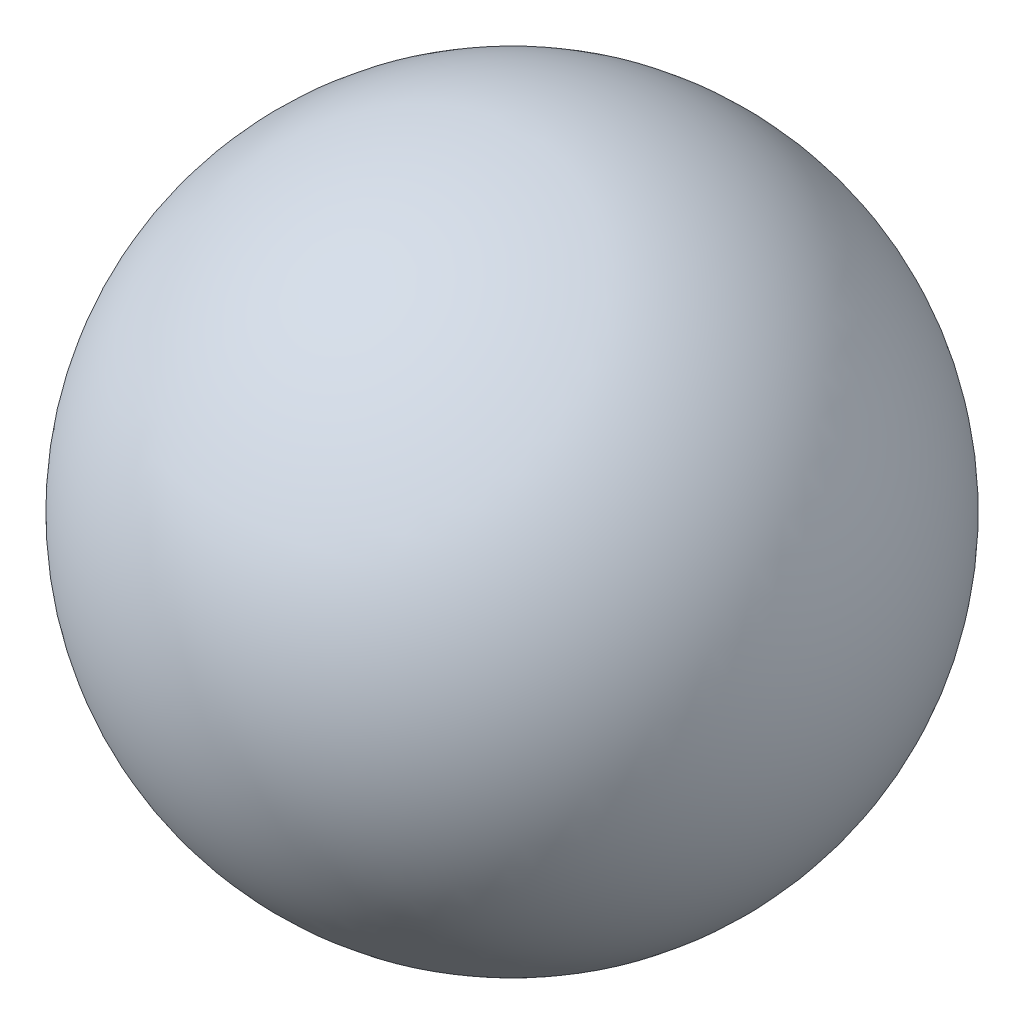
ISO-10303-21;
HEADER;
FILE_DESCRIPTION(('STEP AP214'),'2;1');
FILE_NAME('part.step','',(''),(''),'','','');
FILE_SCHEMA(('AUTOMOTIVE_DESIGN { 1 0 10303 214 1 1 1 1 }'));
ENDSEC;
DATA;
#1=APPLICATION_CONTEXT('core data for automotive mechanical design processes');
#2=APPLICATION_PROTOCOL_DEFINITION('international standard','automotive_design',2000,#1);
#3=PRODUCT_CONTEXT('',#1,'mechanical');
#4=PRODUCT('Part','Part','',(#3));
#5=PRODUCT_RELATED_PRODUCT_CATEGORY('part','',(#4));
#6=PRODUCT_DEFINITION_FORMATION('','',#4);
#7=PRODUCT_DEFINITION_CONTEXT('part definition',#1,'design');
#8=PRODUCT_DEFINITION('design','',#6,#7);
#9=PRODUCT_DEFINITION_SHAPE('','',#8);
#10=(LENGTH_UNIT() NAMED_UNIT(*) SI_UNIT(.MILLI.,.METRE.));
#11=(NAMED_UNIT(*) PLANE_ANGLE_UNIT() SI_UNIT($,.RADIAN.));
#12=(NAMED_UNIT(*) SI_UNIT($,.STERADIAN.) SOLID_ANGLE_UNIT());
#13=UNCERTAINTY_MEASURE_WITH_UNIT(LENGTH_MEASURE(1.E-05),#10,'distance_accuracy_value','');
#14=(GEOMETRIC_REPRESENTATION_CONTEXT(3) GLOBAL_UNCERTAINTY_ASSIGNED_CONTEXT((#13)) GLOBAL_UNIT_ASSIGNED_CONTEXT((#10,
#11,#12)) REPRESENTATION_CONTEXT('',''));
#15=CARTESIAN_POINT('',(0.,0.,0.));
#16=DIRECTION('',(0.,0.,1.));
#17=DIRECTION('',(1.,0.,0.));
#18=AXIS2_PLACEMENT_3D('',#15,#16,#17);
#19=CARTESIAN_POINT('',(0.,0.,0.));
#20=DIRECTION('',(0.,1.,0.));
#21=DIRECTION('',(1.,0.,0.));
#22=AXIS2_PLACEMENT_3D('',#19,#20,#21);
#23=SPHERICAL_SURFACE('',#22,17.3);
#24=CARTESIAN_POINT('',(0.,17.3,0.));
#25=VERTEX_POINT('',#24);
#26=VERTEX_LOOP('',#25);
#27=FACE_BOUND('',#26,.T.);
#28=ADVANCED_FACE('F31',(#27),#23,.T.);
#29=CLOSED_SHELL('',(#28));
#30=MANIFOLD_SOLID_BREP('B2',#29);
#31=ADVANCED_BREP_SHAPE_REPRESENTATION('',(#18,#30),#14);
#32=SHAPE_DEFINITION_REPRESENTATION(#9,#31);
ENDSEC;
END-ISO-10303-21;
